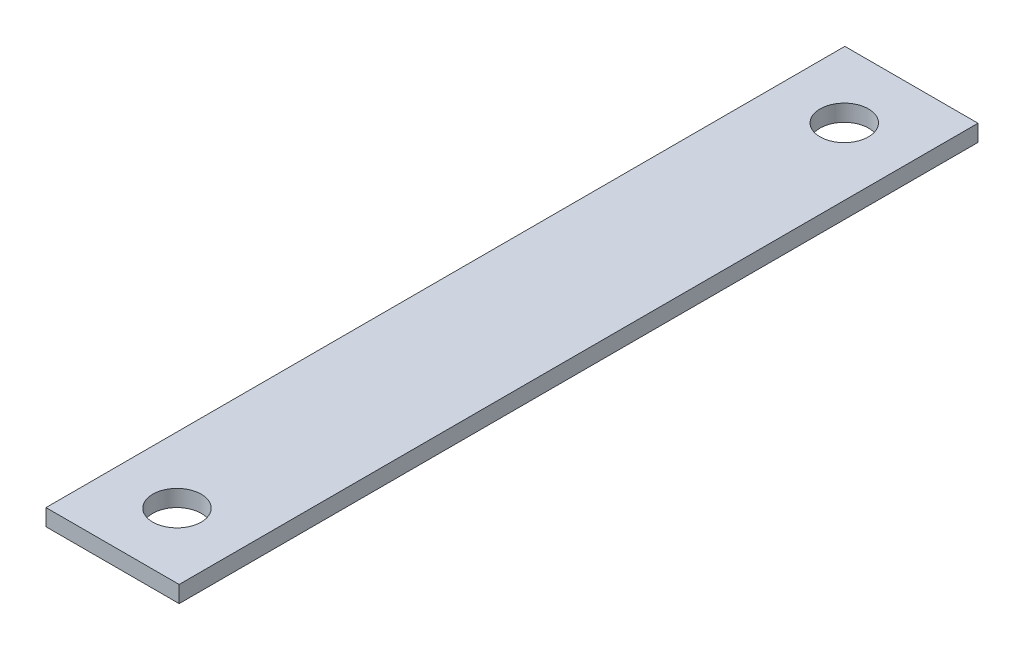
ISO-10303-21;
HEADER;
FILE_DESCRIPTION(('STEP AP214'),'2;1');
FILE_NAME('part.step','',(''),(''),'','','');
FILE_SCHEMA(('AUTOMOTIVE_DESIGN { 1 0 10303 214 1 1 1 1 }'));
ENDSEC;
DATA;
#1=APPLICATION_CONTEXT('core data for automotive mechanical design processes');
#2=APPLICATION_PROTOCOL_DEFINITION('international standard','automotive_design',2000,#1);
#3=PRODUCT_CONTEXT('',#1,'mechanical');
#4=PRODUCT('Part','Part','',(#3));
#5=PRODUCT_RELATED_PRODUCT_CATEGORY('part','',(#4));
#6=PRODUCT_DEFINITION_FORMATION('','',#4);
#7=PRODUCT_DEFINITION_CONTEXT('part definition',#1,'design');
#8=PRODUCT_DEFINITION('design','',#6,#7);
#9=PRODUCT_DEFINITION_SHAPE('','',#8);
#10=(LENGTH_UNIT() NAMED_UNIT(*) SI_UNIT(.MILLI.,.METRE.));
#11=(NAMED_UNIT(*) PLANE_ANGLE_UNIT() SI_UNIT($,.RADIAN.));
#12=(NAMED_UNIT(*) SI_UNIT($,.STERADIAN.) SOLID_ANGLE_UNIT());
#13=UNCERTAINTY_MEASURE_WITH_UNIT(LENGTH_MEASURE(1.E-05),#10,'distance_accuracy_value','');
#14=(GEOMETRIC_REPRESENTATION_CONTEXT(3) GLOBAL_UNCERTAINTY_ASSIGNED_CONTEXT((#13)) GLOBAL_UNIT_ASSIGNED_CONTEXT((#10,
#11,#12)) REPRESENTATION_CONTEXT('',''));
#15=CARTESIAN_POINT('',(0.,0.,0.));
#16=DIRECTION('',(0.,0.,1.));
#17=DIRECTION('',(1.,0.,0.));
#18=AXIS2_PLACEMENT_3D('',#15,#16,#17);
#19=CARTESIAN_POINT('',(0.,1.5875,0.));
#20=DIRECTION('',(0.,1.,0.));
#21=DIRECTION('',(0.,0.,1.));
#22=AXIS2_PLACEMENT_3D('',#19,#20,#21);
#23=PLANE('',#22);
#24=CARTESIAN_POINT('',(6.29321488132639,1.5875,-95.1875424257115));
#25=DIRECTION('',(0.,1.,0.));
#26=DIRECTION('',(0.,0.,1.));
#27=AXIS2_PLACEMENT_3D('',#24,#25,#26);
#28=CIRCLE('',#27,2.31);
#29=CARTESIAN_POINT('',(6.29321488132639,1.5875,-92.8775424257115));
#30=VERTEX_POINT('',#29);
#31=EDGE_CURVE('E100',#30,#30,#28,.T.);
#32=ORIENTED_EDGE('',*,*,#31,.F.);
#33=EDGE_LOOP('',(#32));
#34=FACE_BOUND('',#33,.T.);
#35=DIRECTION('',(0.,0.,1.));
#36=VECTOR('',#35,1.);
#37=CARTESIAN_POINT('',(0.,1.5875,-101.537542425712));
#38=LINE('',#37,#36);
#39=CARTESIAN_POINT('',(0.,1.5875,-101.537542425712));
#40=VERTEX_POINT('',#39);
#41=CARTESIAN_POINT('',(0.,1.5875,-25.3375424257115));
#42=VERTEX_POINT('',#41);
#43=EDGE_CURVE('E85',#40,#42,#38,.T.);
#44=ORIENTED_EDGE('',*,*,#43,.T.);
#45=DIRECTION('',(1.,0.,0.));
#46=VECTOR('',#45,1.);
#47=CARTESIAN_POINT('',(0.,1.5875,-25.3375424257115));
#48=LINE('',#47,#46);
#49=CARTESIAN_POINT('',(12.7,1.5875,-25.3375424257115));
#50=VERTEX_POINT('',#49);
#51=EDGE_CURVE('E80',#42,#50,#48,.T.);
#52=ORIENTED_EDGE('',*,*,#51,.T.);
#53=DIRECTION('',(0.,0.,-1.));
#54=VECTOR('',#53,1.);
#55=CARTESIAN_POINT('',(12.7,1.5875,-101.537542425712));
#56=LINE('',#55,#54);
#57=CARTESIAN_POINT('',(12.7,1.5875,-101.537542425712));
#58=VERTEX_POINT('',#57);
#59=EDGE_CURVE('E83',#50,#58,#56,.T.);
#60=ORIENTED_EDGE('',*,*,#59,.T.);
#61=DIRECTION('',(-1.,0.,0.));
#62=VECTOR('',#61,1.);
#63=CARTESIAN_POINT('',(0.,1.5875,-101.537542425712));
#64=LINE('',#63,#62);
#65=EDGE_CURVE('E50',#58,#40,#64,.T.);
#66=ORIENTED_EDGE('',*,*,#65,.T.);
#67=EDGE_LOOP('',(#44,#52,#60,#66));
#68=FACE_BOUND('',#67,.T.);
#69=CARTESIAN_POINT('',(6.29321488132706,1.5875,-31.5375424257115));
#70=DIRECTION('',(0.,1.,0.));
#71=DIRECTION('',(0.,0.,1.));
#72=AXIS2_PLACEMENT_3D('',#69,#70,#71);
#73=CIRCLE('',#72,2.31);
#74=CARTESIAN_POINT('',(6.29321488132706,1.5875,-29.2275424257115));
#75=VERTEX_POINT('',#74);
#76=EDGE_CURVE('E115',#75,#75,#73,.T.);
#77=ORIENTED_EDGE('',*,*,#76,.F.);
#78=EDGE_LOOP('',(#77));
#79=FACE_BOUND('',#78,.T.);
#80=ADVANCED_FACE('F33',(#34,#68,#79),#23,.T.);
#81=CARTESIAN_POINT('',(0.,0.,0.));
#82=DIRECTION('',(0.,1.,0.));
#83=DIRECTION('',(0.,0.,1.));
#84=AXIS2_PLACEMENT_3D('',#81,#82,#83);
#85=PLANE('',#84);
#86=DIRECTION('',(0.,0.,1.));
#87=VECTOR('',#86,1.);
#88=CARTESIAN_POINT('',(0.,0.,-101.537542425712));
#89=LINE('',#88,#87);
#90=CARTESIAN_POINT('',(0.,0.,-101.537542425712));
#91=VERTEX_POINT('',#90);
#92=CARTESIAN_POINT('',(0.,0.,-25.3375424257115));
#93=VERTEX_POINT('',#92);
#94=EDGE_CURVE('E97',#91,#93,#89,.T.);
#95=ORIENTED_EDGE('',*,*,#94,.F.);
#96=DIRECTION('',(-1.,0.,0.));
#97=VECTOR('',#96,1.);
#98=CARTESIAN_POINT('',(0.,0.,-101.537542425712));
#99=LINE('',#98,#97);
#100=CARTESIAN_POINT('',(12.7,0.,-101.537542425712));
#101=VERTEX_POINT('',#100);
#102=EDGE_CURVE('E73',#101,#91,#99,.T.);
#103=ORIENTED_EDGE('',*,*,#102,.F.);
#104=DIRECTION('',(0.,0.,-1.));
#105=VECTOR('',#104,1.);
#106=CARTESIAN_POINT('',(12.7,0.,-101.537542425712));
#107=LINE('',#106,#105);
#108=CARTESIAN_POINT('',(12.7,0.,-25.3375424257115));
#109=VERTEX_POINT('',#108);
#110=EDGE_CURVE('E67',#109,#101,#107,.T.);
#111=ORIENTED_EDGE('',*,*,#110,.F.);
#112=DIRECTION('',(1.,0.,0.));
#113=VECTOR('',#112,1.);
#114=CARTESIAN_POINT('',(0.,0.,-25.3375424257115));
#115=LINE('',#114,#113);
#116=EDGE_CURVE('E89',#93,#109,#115,.T.);
#117=ORIENTED_EDGE('',*,*,#116,.F.);
#118=EDGE_LOOP('',(#95,#103,#111,#117));
#119=FACE_BOUND('',#118,.T.);
#120=CARTESIAN_POINT('',(6.29321488132639,0.,-95.1875424257115));
#121=DIRECTION('',(0.,1.,0.));
#122=DIRECTION('',(0.,0.,1.));
#123=AXIS2_PLACEMENT_3D('',#120,#121,#122);
#124=CIRCLE('',#123,2.31);
#125=CARTESIAN_POINT('',(6.29321488132639,0.,-92.8775424257115));
#126=VERTEX_POINT('',#125);
#127=EDGE_CURVE('E112',#126,#126,#124,.T.);
#128=ORIENTED_EDGE('',*,*,#127,.T.);
#129=EDGE_LOOP('',(#128));
#130=FACE_BOUND('',#129,.T.);
#131=CARTESIAN_POINT('',(6.29321488132706,0.,-31.5375424257115));
#132=DIRECTION('',(0.,1.,0.));
#133=DIRECTION('',(0.,0.,1.));
#134=AXIS2_PLACEMENT_3D('',#131,#132,#133);
#135=CIRCLE('',#134,2.31);
#136=CARTESIAN_POINT('',(6.29321488132706,0.,-29.2275424257115));
#137=VERTEX_POINT('',#136);
#138=EDGE_CURVE('E118',#137,#137,#135,.T.);
#139=ORIENTED_EDGE('',*,*,#138,.T.);
#140=EDGE_LOOP('',(#139));
#141=FACE_BOUND('',#140,.T.);
#142=ADVANCED_FACE('F108',(#119,#130,#141),#85,.F.);
#143=CARTESIAN_POINT('',(0.,1.5875,-101.537542425712));
#144=DIRECTION('',(1.,0.,0.));
#145=DIRECTION('',(0.,0.,-1.));
#146=AXIS2_PLACEMENT_3D('',#143,#144,#145);
#147=PLANE('',#146);
#148=ORIENTED_EDGE('',*,*,#94,.T.);
#149=DIRECTION('',(0.,-1.,0.));
#150=VECTOR('',#149,1.);
#151=CARTESIAN_POINT('',(0.,1.5875,-25.3375424257115));
#152=LINE('',#151,#150);
#153=EDGE_CURVE('E11',#42,#93,#152,.T.);
#154=ORIENTED_EDGE('',*,*,#153,.F.);
#155=ORIENTED_EDGE('',*,*,#43,.F.);
#156=DIRECTION('',(0.,-1.,0.));
#157=VECTOR('',#156,1.);
#158=CARTESIAN_POINT('',(0.,1.5875,-101.537542425712));
#159=LINE('',#158,#157);
#160=EDGE_CURVE('E93',#40,#91,#159,.T.);
#161=ORIENTED_EDGE('',*,*,#160,.T.);
#162=EDGE_LOOP('',(#148,#154,#155,#161));
#163=FACE_BOUND('',#162,.T.);
#164=ADVANCED_FACE('F35',(#163),#147,.F.);
#165=CARTESIAN_POINT('',(0.,1.5875,-25.3375424257115));
#166=DIRECTION('',(0.,0.,-1.));
#167=DIRECTION('',(-1.,0.,0.));
#168=AXIS2_PLACEMENT_3D('',#165,#166,#167);
#169=PLANE('',#168);
#170=ORIENTED_EDGE('',*,*,#116,.T.);
#171=DIRECTION('',(0.,-1.,0.));
#172=VECTOR('',#171,1.);
#173=CARTESIAN_POINT('',(12.7,1.5875,-25.3375424257115));
#174=LINE('',#173,#172);
#175=EDGE_CURVE('E42',#50,#109,#174,.T.);
#176=ORIENTED_EDGE('',*,*,#175,.F.);
#177=ORIENTED_EDGE('',*,*,#51,.F.);
#178=ORIENTED_EDGE('',*,*,#153,.T.);
#179=EDGE_LOOP('',(#170,#176,#177,#178));
#180=FACE_BOUND('',#179,.T.);
#181=ADVANCED_FACE('F88',(#180),#169,.F.);
#182=CARTESIAN_POINT('',(12.7,1.5875,-101.537542425712));
#183=DIRECTION('',(-1.,0.,0.));
#184=DIRECTION('',(0.,0.,1.));
#185=AXIS2_PLACEMENT_3D('',#182,#183,#184);
#186=PLANE('',#185);
#187=ORIENTED_EDGE('',*,*,#110,.T.);
#188=DIRECTION('',(0.,-1.,0.));
#189=VECTOR('',#188,1.);
#190=CARTESIAN_POINT('',(12.7,1.5875,-101.537542425712));
#191=LINE('',#190,#189);
#192=EDGE_CURVE('E90',#58,#101,#191,.T.);
#193=ORIENTED_EDGE('',*,*,#192,.F.);
#194=ORIENTED_EDGE('',*,*,#59,.F.);
#195=ORIENTED_EDGE('',*,*,#175,.T.);
#196=EDGE_LOOP('',(#187,#193,#194,#195));
#197=FACE_BOUND('',#196,.T.);
#198=ADVANCED_FACE('F91',(#197),#186,.F.);
#199=CARTESIAN_POINT('',(0.,1.5875,-101.537542425712));
#200=DIRECTION('',(0.,0.,1.));
#201=DIRECTION('',(1.,0.,0.));
#202=AXIS2_PLACEMENT_3D('',#199,#200,#201);
#203=PLANE('',#202);
#204=ORIENTED_EDGE('',*,*,#102,.T.);
#205=ORIENTED_EDGE('',*,*,#160,.F.);
#206=ORIENTED_EDGE('',*,*,#65,.F.);
#207=ORIENTED_EDGE('',*,*,#192,.T.);
#208=EDGE_LOOP('',(#204,#205,#206,#207));
#209=FACE_BOUND('',#208,.T.);
#210=ADVANCED_FACE('F105',(#209),#203,.F.);
#211=CARTESIAN_POINT('',(6.29321488132639,1.5875,-95.1875424257115));
#212=DIRECTION('',(0.,-1.,0.));
#213=DIRECTION('',(0.,0.,-1.));
#214=AXIS2_PLACEMENT_3D('',#211,#212,#213);
#215=CYLINDRICAL_SURFACE('',#214,2.31);
#216=ORIENTED_EDGE('',*,*,#31,.T.);
#217=EDGE_LOOP('',(#216));
#218=FACE_BOUND('',#217,.T.);
#219=ORIENTED_EDGE('',*,*,#127,.F.);
#220=EDGE_LOOP('',(#219));
#221=FACE_BOUND('',#220,.T.);
#222=ADVANCED_FACE('F135',(#218,#221),#215,.F.);
#223=CARTESIAN_POINT('',(6.29321488132706,1.5875,-31.5375424257115));
#224=DIRECTION('',(0.,-1.,0.));
#225=DIRECTION('',(0.,0.,-1.));
#226=AXIS2_PLACEMENT_3D('',#223,#224,#225);
#227=CYLINDRICAL_SURFACE('',#226,2.31);
#228=ORIENTED_EDGE('',*,*,#76,.T.);
#229=EDGE_LOOP('',(#228));
#230=FACE_BOUND('',#229,.T.);
#231=ORIENTED_EDGE('',*,*,#138,.F.);
#232=EDGE_LOOP('',(#231));
#233=FACE_BOUND('',#232,.T.);
#234=ADVANCED_FACE('F124',(#230,#233),#227,.F.);
#235=CLOSED_SHELL('',(#80,#142,#164,#181,#198,#210,#222,#234));
#236=MANIFOLD_SOLID_BREP('B2',#235);
#237=ADVANCED_BREP_SHAPE_REPRESENTATION('',(#18,#236),#14);
#238=SHAPE_DEFINITION_REPRESENTATION(#9,#237);
ENDSEC;
END-ISO-10303-21;
